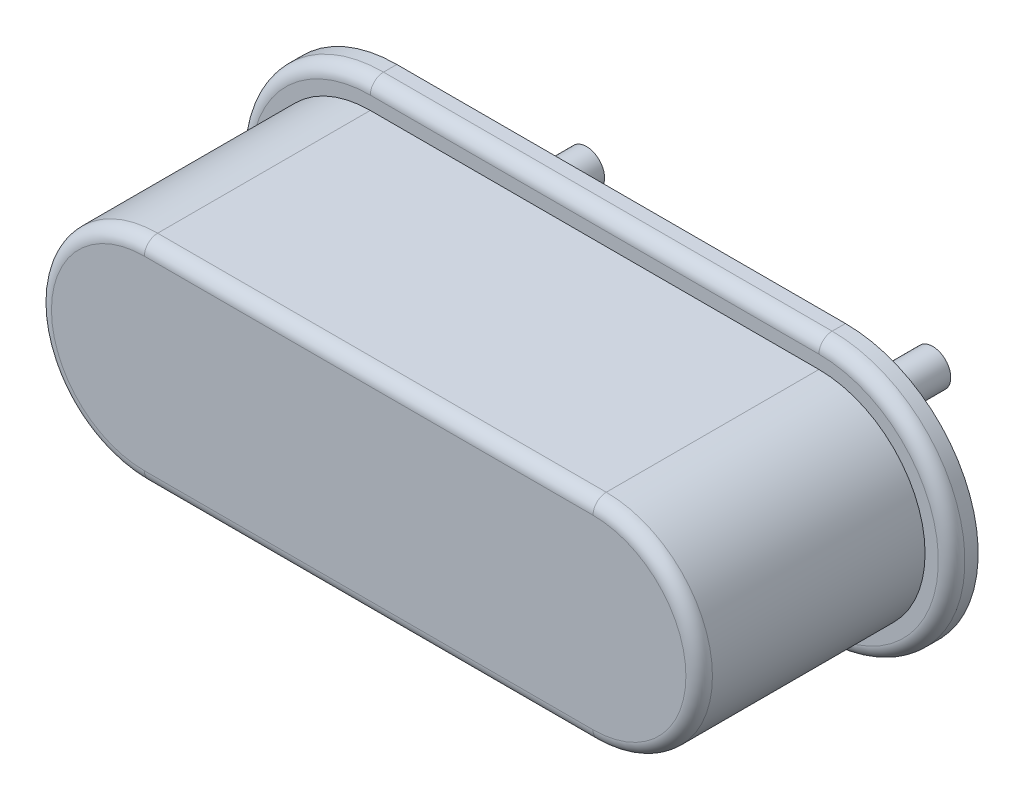
ISO-10303-21;
HEADER;
FILE_DESCRIPTION(('STEP AP214'),'2;1');
FILE_NAME('part.step','',(''),(''),'','','');
FILE_SCHEMA(('AUTOMOTIVE_DESIGN { 1 0 10303 214 1 1 1 1 }'));
ENDSEC;
DATA;
#1=APPLICATION_CONTEXT('core data for automotive mechanical design processes');
#2=APPLICATION_PROTOCOL_DEFINITION('international standard','automotive_design',2000,#1);
#3=PRODUCT_CONTEXT('',#1,'mechanical');
#4=PRODUCT('Part','Part','',(#3));
#5=PRODUCT_RELATED_PRODUCT_CATEGORY('part','',(#4));
#6=PRODUCT_DEFINITION_FORMATION('','',#4);
#7=PRODUCT_DEFINITION_CONTEXT('part definition',#1,'design');
#8=PRODUCT_DEFINITION('design','',#6,#7);
#9=PRODUCT_DEFINITION_SHAPE('','',#8);
#10=(LENGTH_UNIT() NAMED_UNIT(*) SI_UNIT(.MILLI.,.METRE.));
#11=(NAMED_UNIT(*) PLANE_ANGLE_UNIT() SI_UNIT($,.RADIAN.));
#12=(NAMED_UNIT(*) SI_UNIT($,.STERADIAN.) SOLID_ANGLE_UNIT());
#13=UNCERTAINTY_MEASURE_WITH_UNIT(LENGTH_MEASURE(1.E-05),#10,'distance_accuracy_value','');
#14=(GEOMETRIC_REPRESENTATION_CONTEXT(3) GLOBAL_UNCERTAINTY_ASSIGNED_CONTEXT((#13)) GLOBAL_UNIT_ASSIGNED_CONTEXT((#10,
#11,#12)) REPRESENTATION_CONTEXT('',''));
#15=CARTESIAN_POINT('',(0.,0.,0.));
#16=DIRECTION('',(0.,0.,1.));
#17=DIRECTION('',(1.,0.,0.));
#18=AXIS2_PLACEMENT_3D('',#15,#16,#17);
#19=CARTESIAN_POINT('',(3.11,1.84,0.));
#20=DIRECTION('',(0.,0.,1.));
#21=DIRECTION('',(1.,0.,0.));
#22=AXIS2_PLACEMENT_3D('',#19,#20,#21);
#23=PLANE('',#22);
#24=CARTESIAN_POINT('',(2.4,0.,0.));
#25=DIRECTION('',(0.,0.,1.));
#26=DIRECTION('',(1.,0.,0.));
#27=AXIS2_PLACEMENT_3D('',#24,#25,#26);
#28=CIRCLE('',#27,0.25);
#29=CARTESIAN_POINT('',(2.15,0.,0.));
#30=VERTEX_POINT('',#29);
#31=EDGE_CURVE('E240',#30,#30,#28,.T.);
#32=ORIENTED_EDGE('',*,*,#31,.T.);
#33=EDGE_LOOP('',(#32));
#34=FACE_BOUND('',#33,.T.);
#35=CARTESIAN_POINT('',(-2.4,0.,0.));
#36=DIRECTION('',(0.,0.,1.));
#37=DIRECTION('',(1.,0.,0.));
#38=AXIS2_PLACEMENT_3D('',#35,#36,#37);
#39=CIRCLE('',#38,0.25);
#40=CARTESIAN_POINT('',(-2.65,0.,0.));
#41=VERTEX_POINT('',#40);
#42=EDGE_CURVE('E230',#41,#41,#39,.T.);
#43=ORIENTED_EDGE('',*,*,#42,.T.);
#44=EDGE_LOOP('',(#43));
#45=FACE_BOUND('',#44,.T.);
#46=CARTESIAN_POINT('',(3.11,0.,0.));
#47=DIRECTION('',(0.,0.,1.));
#48=DIRECTION('',(1.,0.,0.));
#49=AXIS2_PLACEMENT_3D('',#46,#47,#48);
#50=CIRCLE('',#49,1.84);
#51=CARTESIAN_POINT('',(3.11,-1.84,0.));
#52=VERTEX_POINT('',#51);
#53=CARTESIAN_POINT('',(3.11,1.84,0.));
#54=VERTEX_POINT('',#53);
#55=EDGE_CURVE('E182',#52,#54,#50,.T.);
#56=ORIENTED_EDGE('',*,*,#55,.F.);
#57=DIRECTION('',(1.,0.,0.));
#58=VECTOR('',#57,1.);
#59=CARTESIAN_POINT('',(-3.11,-1.84,0.));
#60=LINE('',#59,#58);
#61=CARTESIAN_POINT('',(-3.11,-1.84,0.));
#62=VERTEX_POINT('',#61);
#63=EDGE_CURVE('E28',#62,#52,#60,.T.);
#64=ORIENTED_EDGE('',*,*,#63,.F.);
#65=CARTESIAN_POINT('',(-3.11,0.,0.));
#66=DIRECTION('',(0.,0.,1.));
#67=DIRECTION('',(1.,0.,0.));
#68=AXIS2_PLACEMENT_3D('',#65,#66,#67);
#69=CIRCLE('',#68,1.84);
#70=CARTESIAN_POINT('',(-3.11,1.84,0.));
#71=VERTEX_POINT('',#70);
#72=EDGE_CURVE('E11',#71,#62,#69,.T.);
#73=ORIENTED_EDGE('',*,*,#72,.F.);
#74=DIRECTION('',(-1.,0.,0.));
#75=VECTOR('',#74,1.);
#76=CARTESIAN_POINT('',(3.11,1.84,0.));
#77=LINE('',#76,#75);
#78=EDGE_CURVE('E154',#54,#71,#77,.T.);
#79=ORIENTED_EDGE('',*,*,#78,.F.);
#80=EDGE_LOOP('',(#56,#64,#73,#79));
#81=FACE_BOUND('',#80,.T.);
#82=ADVANCED_FACE('F17',(#34,#45,#81),#23,.F.);
#83=CARTESIAN_POINT('',(-3.11,0.,0.));
#84=DIRECTION('',(0.,0.,1.));
#85=DIRECTION('',(-1.,0.,0.));
#86=AXIS2_PLACEMENT_3D('',#83,#84,#85);
#87=CYLINDRICAL_SURFACE('',#86,1.84);
#88=CARTESIAN_POINT('',(-3.11,0.,0.184));
#89=DIRECTION('',(0.,0.,1.));
#90=DIRECTION('',(-1.,0.,0.));
#91=AXIS2_PLACEMENT_3D('',#88,#89,#90);
#92=CIRCLE('',#91,1.84);
#93=CARTESIAN_POINT('',(-3.11,1.84,0.184));
#94=VERTEX_POINT('',#93);
#95=CARTESIAN_POINT('',(-3.11,-1.84,0.184));
#96=VERTEX_POINT('',#95);
#97=EDGE_CURVE('E161',#94,#96,#92,.T.);
#98=ORIENTED_EDGE('',*,*,#97,.F.);
#99=DIRECTION('',(0.,0.,1.));
#100=VECTOR('',#99,1.);
#101=CARTESIAN_POINT('',(-3.11,1.84,0.));
#102=LINE('',#101,#100);
#103=EDGE_CURVE('E158',#71,#94,#102,.T.);
#104=ORIENTED_EDGE('',*,*,#103,.F.);
#105=ORIENTED_EDGE('',*,*,#72,.T.);
#106=DIRECTION('',(0.,0.,1.));
#107=VECTOR('',#106,1.);
#108=CARTESIAN_POINT('',(-3.11,-1.84,0.));
#109=LINE('',#108,#107);
#110=EDGE_CURVE('E185',#62,#96,#109,.T.);
#111=ORIENTED_EDGE('',*,*,#110,.T.);
#112=EDGE_LOOP('',(#98,#104,#105,#111));
#113=FACE_BOUND('',#112,.T.);
#114=ADVANCED_FACE('F159',(#113),#87,.T.);
#115=CARTESIAN_POINT('',(-3.11,-1.84,0.));
#116=DIRECTION('',(0.,-1.,0.));
#117=DIRECTION('',(0.,0.,-1.));
#118=AXIS2_PLACEMENT_3D('',#115,#116,#117);
#119=PLANE('',#118);
#120=DIRECTION('',(1.,0.,0.));
#121=VECTOR('',#120,1.);
#122=CARTESIAN_POINT('',(0.,-1.84,0.184));
#123=LINE('',#122,#121);
#124=CARTESIAN_POINT('',(3.11,-1.84,0.184));
#125=VERTEX_POINT('',#124);
#126=EDGE_CURVE('E176',#96,#125,#123,.T.);
#127=ORIENTED_EDGE('',*,*,#126,.F.);
#128=ORIENTED_EDGE('',*,*,#110,.F.);
#129=ORIENTED_EDGE('',*,*,#63,.T.);
#130=DIRECTION('',(0.,0.,1.));
#131=VECTOR('',#130,1.);
#132=CARTESIAN_POINT('',(3.11,-1.84,0.));
#133=LINE('',#132,#131);
#134=EDGE_CURVE('E166',#52,#125,#133,.T.);
#135=ORIENTED_EDGE('',*,*,#134,.T.);
#136=EDGE_LOOP('',(#127,#128,#129,#135));
#137=FACE_BOUND('',#136,.T.);
#138=ADVANCED_FACE('F374',(#137),#119,.T.);
#139=CARTESIAN_POINT('',(3.11,1.84,0.368));
#140=DIRECTION('',(0.,0.,1.));
#141=DIRECTION('',(1.,0.,0.));
#142=AXIS2_PLACEMENT_3D('',#139,#140,#141);
#143=PLANE('',#142);
#144=DIRECTION('',(1.,0.,0.));
#145=VECTOR('',#144,1.);
#146=CARTESIAN_POINT('',(3.11,1.472,0.368));
#147=LINE('',#146,#145);
#148=CARTESIAN_POINT('',(-3.11,1.472,0.368));
#149=VERTEX_POINT('',#148);
#150=CARTESIAN_POINT('',(3.11,1.472,0.368));
#151=VERTEX_POINT('',#150);
#152=EDGE_CURVE('E179',#149,#151,#147,.T.);
#153=ORIENTED_EDGE('',*,*,#152,.T.);
#154=CARTESIAN_POINT('',(3.11,0.,0.368));
#155=DIRECTION('',(0.,0.,-1.));
#156=DIRECTION('',(1.,0.,0.));
#157=AXIS2_PLACEMENT_3D('',#154,#155,#156);
#158=CIRCLE('',#157,1.472);
#159=CARTESIAN_POINT('',(3.11,-1.472,0.368));
#160=VERTEX_POINT('',#159);
#161=EDGE_CURVE('E210',#151,#160,#158,.T.);
#162=ORIENTED_EDGE('',*,*,#161,.T.);
#163=DIRECTION('',(-1.,0.,0.));
#164=VECTOR('',#163,1.);
#165=CARTESIAN_POINT('',(0.,-1.472,0.368));
#166=LINE('',#165,#164);
#167=CARTESIAN_POINT('',(-3.11,-1.472,0.368));
#168=VERTEX_POINT('',#167);
#169=EDGE_CURVE('E21',#160,#168,#166,.T.);
#170=ORIENTED_EDGE('',*,*,#169,.T.);
#171=CARTESIAN_POINT('',(-3.11,0.,0.368));
#172=DIRECTION('',(0.,0.,-1.));
#173=DIRECTION('',(1.,0.,0.));
#174=AXIS2_PLACEMENT_3D('',#171,#172,#173);
#175=CIRCLE('',#174,1.472);
#176=EDGE_CURVE('E115',#168,#149,#175,.T.);
#177=ORIENTED_EDGE('',*,*,#176,.T.);
#178=EDGE_LOOP('',(#153,#162,#170,#177));
#179=FACE_BOUND('',#178,.T.);
#180=CARTESIAN_POINT('',(3.11,0.,0.368));
#181=DIRECTION('',(0.,0.,-1.));
#182=DIRECTION('',(1.,0.,0.));
#183=AXIS2_PLACEMENT_3D('',#180,#181,#182);
#184=CIRCLE('',#183,1.656);
#185=CARTESIAN_POINT('',(3.11,1.656,0.368));
#186=VERTEX_POINT('',#185);
#187=CARTESIAN_POINT('',(3.11,-1.656,0.368));
#188=VERTEX_POINT('',#187);
#189=EDGE_CURVE('E249',#186,#188,#184,.T.);
#190=ORIENTED_EDGE('',*,*,#189,.F.);
#191=DIRECTION('',(1.,0.,0.));
#192=VECTOR('',#191,1.);
#193=CARTESIAN_POINT('',(3.11,1.656,0.368));
#194=LINE('',#193,#192);
#195=CARTESIAN_POINT('',(-3.11,1.656,0.368));
#196=VERTEX_POINT('',#195);
#197=EDGE_CURVE('E188',#196,#186,#194,.T.);
#198=ORIENTED_EDGE('',*,*,#197,.F.);
#199=CARTESIAN_POINT('',(-3.11,0.,0.368));
#200=DIRECTION('',(0.,0.,-1.));
#201=DIRECTION('',(-1.,0.,0.));
#202=AXIS2_PLACEMENT_3D('',#199,#200,#201);
#203=CIRCLE('',#202,1.656);
#204=CARTESIAN_POINT('',(-3.11,-1.656,0.368));
#205=VERTEX_POINT('',#204);
#206=EDGE_CURVE('E197',#205,#196,#203,.T.);
#207=ORIENTED_EDGE('',*,*,#206,.F.);
#208=DIRECTION('',(-1.,0.,0.));
#209=VECTOR('',#208,1.);
#210=CARTESIAN_POINT('',(0.,-1.656,0.368));
#211=LINE('',#210,#209);
#212=EDGE_CURVE('E222',#188,#205,#211,.T.);
#213=ORIENTED_EDGE('',*,*,#212,.F.);
#214=EDGE_LOOP('',(#190,#198,#207,#213));
#215=FACE_BOUND('',#214,.T.);
#216=ADVANCED_FACE('F397',(#179,#215),#143,.T.);
#217=CARTESIAN_POINT('',(3.11,0.,0.));
#218=DIRECTION('',(0.,0.,1.));
#219=DIRECTION('',(1.,0.,0.));
#220=AXIS2_PLACEMENT_3D('',#217,#218,#219);
#221=CYLINDRICAL_SURFACE('',#220,1.84);
#222=CARTESIAN_POINT('',(3.11,0.,0.184));
#223=DIRECTION('',(0.,0.,1.));
#224=DIRECTION('',(1.,0.,0.));
#225=AXIS2_PLACEMENT_3D('',#222,#223,#224);
#226=CIRCLE('',#225,1.84);
#227=CARTESIAN_POINT('',(3.11,1.84,0.184));
#228=VERTEX_POINT('',#227);
#229=EDGE_CURVE('E263',#125,#228,#226,.T.);
#230=ORIENTED_EDGE('',*,*,#229,.F.);
#231=ORIENTED_EDGE('',*,*,#134,.F.);
#232=ORIENTED_EDGE('',*,*,#55,.T.);
#233=DIRECTION('',(0.,0.,1.));
#234=VECTOR('',#233,1.);
#235=CARTESIAN_POINT('',(3.11,1.84,0.));
#236=LINE('',#235,#234);
#237=EDGE_CURVE('E169',#54,#228,#236,.T.);
#238=ORIENTED_EDGE('',*,*,#237,.T.);
#239=EDGE_LOOP('',(#230,#231,#232,#238));
#240=FACE_BOUND('',#239,.T.);
#241=ADVANCED_FACE('F310',(#240),#221,.T.);
#242=CARTESIAN_POINT('',(3.11,1.84,0.));
#243=DIRECTION('',(0.,1.,0.));
#244=DIRECTION('',(1.,0.,0.));
#245=AXIS2_PLACEMENT_3D('',#242,#243,#244);
#246=PLANE('',#245);
#247=DIRECTION('',(-1.,0.,0.));
#248=VECTOR('',#247,1.);
#249=CARTESIAN_POINT('',(3.11,1.84,0.184));
#250=LINE('',#249,#248);
#251=EDGE_CURVE('E191',#228,#94,#250,.T.);
#252=ORIENTED_EDGE('',*,*,#251,.F.);
#253=ORIENTED_EDGE('',*,*,#237,.F.);
#254=ORIENTED_EDGE('',*,*,#78,.T.);
#255=ORIENTED_EDGE('',*,*,#103,.T.);
#256=EDGE_LOOP('',(#252,#253,#254,#255));
#257=FACE_BOUND('',#256,.T.);
#258=ADVANCED_FACE('F168',(#257),#246,.T.);
#259=CARTESIAN_POINT('',(0.,-1.656,0.184));
#260=DIRECTION('',(1.,0.,0.));
#261=DIRECTION('',(0.,-0.707106781186547,0.707106781186548));
#262=AXIS2_PLACEMENT_3D('',#259,#260,#261);
#263=CYLINDRICAL_SURFACE('',#262,0.184);
#264=CARTESIAN_POINT('',(3.11,-1.656,0.184));
#265=DIRECTION('',(1.,0.,0.));
#266=DIRECTION('',(0.,0.,1.));
#267=AXIS2_PLACEMENT_3D('',#264,#265,#266);
#268=CIRCLE('',#267,0.184);
#269=EDGE_CURVE('E267',#188,#125,#268,.T.);
#270=ORIENTED_EDGE('',*,*,#269,.F.);
#271=ORIENTED_EDGE('',*,*,#212,.T.);
#272=CARTESIAN_POINT('',(-3.11,-1.656,0.184));
#273=DIRECTION('',(-1.,0.,0.));
#274=DIRECTION('',(0.,-1.,0.));
#275=AXIS2_PLACEMENT_3D('',#272,#273,#274);
#276=CIRCLE('',#275,0.184);
#277=EDGE_CURVE('E193',#96,#205,#276,.T.);
#278=ORIENTED_EDGE('',*,*,#277,.F.);
#279=ORIENTED_EDGE('',*,*,#126,.T.);
#280=EDGE_LOOP('',(#270,#271,#278,#279));
#281=FACE_BOUND('',#280,.T.);
#282=ADVANCED_FACE('F305',(#281),#263,.T.);
#283=CARTESIAN_POINT('',(-3.11,0.,0.184));
#284=DIRECTION('',(0.,0.,1.));
#285=DIRECTION('',(-1.,0.,0.));
#286=AXIS2_PLACEMENT_3D('',#283,#284,#285);
#287=TOROIDAL_SURFACE('',#286,1.656,0.184);
#288=ORIENTED_EDGE('',*,*,#277,.T.);
#289=ORIENTED_EDGE('',*,*,#206,.T.);
#290=CARTESIAN_POINT('',(-3.11,1.656,0.184));
#291=DIRECTION('',(1.,0.,0.));
#292=DIRECTION('',(0.,1.,0.));
#293=AXIS2_PLACEMENT_3D('',#290,#291,#292);
#294=CIRCLE('',#293,0.184);
#295=EDGE_CURVE('E192',#94,#196,#294,.T.);
#296=ORIENTED_EDGE('',*,*,#295,.F.);
#297=ORIENTED_EDGE('',*,*,#97,.T.);
#298=EDGE_LOOP('',(#288,#289,#296,#297));
#299=FACE_BOUND('',#298,.T.);
#300=ADVANCED_FACE('F395',(#299),#287,.T.);
#301=CARTESIAN_POINT('',(3.11,1.656,0.184));
#302=DIRECTION('',(-1.,0.,0.));
#303=DIRECTION('',(0.,0.707106781186548,0.707106781186547));
#304=AXIS2_PLACEMENT_3D('',#301,#302,#303);
#305=CYLINDRICAL_SURFACE('',#304,0.184);
#306=ORIENTED_EDGE('',*,*,#295,.T.);
#307=ORIENTED_EDGE('',*,*,#197,.T.);
#308=CARTESIAN_POINT('',(3.11,1.656,0.184));
#309=DIRECTION('',(1.,0.,0.));
#310=DIRECTION('',(0.,1.,0.));
#311=AXIS2_PLACEMENT_3D('',#308,#309,#310);
#312=CIRCLE('',#311,0.184);
#313=EDGE_CURVE('E253',#228,#186,#312,.T.);
#314=ORIENTED_EDGE('',*,*,#313,.F.);
#315=ORIENTED_EDGE('',*,*,#251,.T.);
#316=EDGE_LOOP('',(#306,#307,#314,#315));
#317=FACE_BOUND('',#316,.T.);
#318=ADVANCED_FACE('F525',(#317),#305,.T.);
#319=CARTESIAN_POINT('',(3.11,0.,0.184));
#320=DIRECTION('',(0.,0.,1.));
#321=DIRECTION('',(1.,0.,0.));
#322=AXIS2_PLACEMENT_3D('',#319,#320,#321);
#323=TOROIDAL_SURFACE('',#322,1.656,0.184);
#324=ORIENTED_EDGE('',*,*,#269,.T.);
#325=ORIENTED_EDGE('',*,*,#229,.T.);
#326=ORIENTED_EDGE('',*,*,#313,.T.);
#327=ORIENTED_EDGE('',*,*,#189,.T.);
#328=EDGE_LOOP('',(#324,#325,#326,#327));
#329=FACE_BOUND('',#328,.T.);
#330=ADVANCED_FACE('F313',(#329),#323,.T.);
#331=CARTESIAN_POINT('',(-3.11,0.,0.368));
#332=DIRECTION('',(0.,0.,1.));
#333=DIRECTION('',(-1.,0.,0.));
#334=AXIS2_PLACEMENT_3D('',#331,#332,#333);
#335=CYLINDRICAL_SURFACE('',#334,1.472);
#336=CARTESIAN_POINT('',(-3.11,0.,3.316));
#337=DIRECTION('',(0.,0.,1.));
#338=DIRECTION('',(-1.,0.,0.));
#339=AXIS2_PLACEMENT_3D('',#336,#337,#338);
#340=CIRCLE('',#339,1.472);
#341=CARTESIAN_POINT('',(-3.11,1.472,3.316));
#342=VERTEX_POINT('',#341);
#343=CARTESIAN_POINT('',(-3.11,-1.472,3.316));
#344=VERTEX_POINT('',#343);
#345=EDGE_CURVE('E232',#342,#344,#340,.T.);
#346=ORIENTED_EDGE('',*,*,#345,.F.);
#347=DIRECTION('',(0.,0.,1.));
#348=VECTOR('',#347,1.);
#349=CARTESIAN_POINT('',(-3.11,1.472,0.368));
#350=LINE('',#349,#348);
#351=EDGE_CURVE('E206',#149,#342,#350,.T.);
#352=ORIENTED_EDGE('',*,*,#351,.F.);
#353=ORIENTED_EDGE('',*,*,#176,.F.);
#354=DIRECTION('',(0.,0.,1.));
#355=VECTOR('',#354,1.);
#356=CARTESIAN_POINT('',(-3.11,-1.472,0.368));
#357=LINE('',#356,#355);
#358=EDGE_CURVE('E212',#168,#344,#357,.T.);
#359=ORIENTED_EDGE('',*,*,#358,.T.);
#360=EDGE_LOOP('',(#346,#352,#353,#359));
#361=FACE_BOUND('',#360,.T.);
#362=ADVANCED_FACE('F358',(#361),#335,.T.);
#363=CARTESIAN_POINT('',(-3.11,-1.472,0.368));
#364=DIRECTION('',(0.,-1.,0.));
#365=DIRECTION('',(0.,0.,-1.));
#366=AXIS2_PLACEMENT_3D('',#363,#364,#365);
#367=PLANE('',#366);
#368=DIRECTION('',(1.,0.,0.));
#369=VECTOR('',#368,1.);
#370=CARTESIAN_POINT('',(0.,-1.472,3.316));
#371=LINE('',#370,#369);
#372=CARTESIAN_POINT('',(3.11,-1.472,3.316));
#373=VERTEX_POINT('',#372);
#374=EDGE_CURVE('E214',#344,#373,#371,.T.);
#375=ORIENTED_EDGE('',*,*,#374,.F.);
#376=ORIENTED_EDGE('',*,*,#358,.F.);
#377=ORIENTED_EDGE('',*,*,#169,.F.);
#378=DIRECTION('',(0.,0.,1.));
#379=VECTOR('',#378,1.);
#380=CARTESIAN_POINT('',(3.11,-1.472,0.368));
#381=LINE('',#380,#379);
#382=EDGE_CURVE('E209',#160,#373,#381,.T.);
#383=ORIENTED_EDGE('',*,*,#382,.T.);
#384=EDGE_LOOP('',(#375,#376,#377,#383));
#385=FACE_BOUND('',#384,.T.);
#386=ADVANCED_FACE('F387',(#385),#367,.T.);
#387=CARTESIAN_POINT('',(3.11,1.472,3.5));
#388=DIRECTION('',(0.,0.,1.));
#389=DIRECTION('',(1.,0.,0.));
#390=AXIS2_PLACEMENT_3D('',#387,#388,#389);
#391=PLANE('',#390);
#392=CARTESIAN_POINT('',(3.11,0.,3.5));
#393=DIRECTION('',(0.,0.,-1.));
#394=DIRECTION('',(1.,0.,0.));
#395=AXIS2_PLACEMENT_3D('',#392,#393,#394);
#396=CIRCLE('',#395,1.288);
#397=CARTESIAN_POINT('',(3.11,1.288,3.5));
#398=VERTEX_POINT('',#397);
#399=CARTESIAN_POINT('',(3.11,-1.288,3.5));
#400=VERTEX_POINT('',#399);
#401=EDGE_CURVE('E281',#398,#400,#396,.T.);
#402=ORIENTED_EDGE('',*,*,#401,.F.);
#403=DIRECTION('',(1.,0.,0.));
#404=VECTOR('',#403,1.);
#405=CARTESIAN_POINT('',(3.11,1.288,3.5));
#406=LINE('',#405,#404);
#407=CARTESIAN_POINT('',(-3.11,1.288,3.5));
#408=VERTEX_POINT('',#407);
#409=EDGE_CURVE('E262',#408,#398,#406,.T.);
#410=ORIENTED_EDGE('',*,*,#409,.F.);
#411=CARTESIAN_POINT('',(-3.11,0.,3.5));
#412=DIRECTION('',(0.,0.,-1.));
#413=DIRECTION('',(-1.,0.,0.));
#414=AXIS2_PLACEMENT_3D('',#411,#412,#413);
#415=CIRCLE('',#414,1.288);
#416=CARTESIAN_POINT('',(-3.11,-1.288,3.5));
#417=VERTEX_POINT('',#416);
#418=EDGE_CURVE('E204',#417,#408,#415,.T.);
#419=ORIENTED_EDGE('',*,*,#418,.F.);
#420=DIRECTION('',(-1.,0.,0.));
#421=VECTOR('',#420,1.);
#422=CARTESIAN_POINT('',(0.,-1.288,3.5));
#423=LINE('',#422,#421);
#424=EDGE_CURVE('E219',#400,#417,#423,.T.);
#425=ORIENTED_EDGE('',*,*,#424,.F.);
#426=EDGE_LOOP('',(#402,#410,#419,#425));
#427=FACE_BOUND('',#426,.T.);
#428=ADVANCED_FACE('F345',(#427),#391,.T.);
#429=CARTESIAN_POINT('',(3.11,0.,0.368));
#430=DIRECTION('',(0.,0.,1.));
#431=DIRECTION('',(1.,0.,0.));
#432=AXIS2_PLACEMENT_3D('',#429,#430,#431);
#433=CYLINDRICAL_SURFACE('',#432,1.472);
#434=CARTESIAN_POINT('',(3.11,0.,3.316));
#435=DIRECTION('',(0.,0.,1.));
#436=DIRECTION('',(1.,0.,0.));
#437=AXIS2_PLACEMENT_3D('',#434,#435,#436);
#438=CIRCLE('',#437,1.472);
#439=CARTESIAN_POINT('',(3.11,1.472,3.316));
#440=VERTEX_POINT('',#439);
#441=EDGE_CURVE('E272',#373,#440,#438,.T.);
#442=ORIENTED_EDGE('',*,*,#441,.F.);
#443=ORIENTED_EDGE('',*,*,#382,.F.);
#444=ORIENTED_EDGE('',*,*,#161,.F.);
#445=DIRECTION('',(0.,0.,1.));
#446=VECTOR('',#445,1.);
#447=CARTESIAN_POINT('',(3.11,1.472,0.368));
#448=LINE('',#447,#446);
#449=EDGE_CURVE('E218',#151,#440,#448,.T.);
#450=ORIENTED_EDGE('',*,*,#449,.T.);
#451=EDGE_LOOP('',(#442,#443,#444,#450));
#452=FACE_BOUND('',#451,.T.);
#453=ADVANCED_FACE('F352',(#452),#433,.T.);
#454=CARTESIAN_POINT('',(3.11,1.472,0.368));
#455=DIRECTION('',(0.,1.,0.));
#456=DIRECTION('',(1.,0.,0.));
#457=AXIS2_PLACEMENT_3D('',#454,#455,#456);
#458=PLANE('',#457);
#459=DIRECTION('',(-1.,0.,0.));
#460=VECTOR('',#459,1.);
#461=CARTESIAN_POINT('',(3.11,1.472,3.316));
#462=LINE('',#461,#460);
#463=EDGE_CURVE('E205',#440,#342,#462,.T.);
#464=ORIENTED_EDGE('',*,*,#463,.F.);
#465=ORIENTED_EDGE('',*,*,#449,.F.);
#466=ORIENTED_EDGE('',*,*,#152,.F.);
#467=ORIENTED_EDGE('',*,*,#351,.T.);
#468=EDGE_LOOP('',(#464,#465,#466,#467));
#469=FACE_BOUND('',#468,.T.);
#470=ADVANCED_FACE('F356',(#469),#458,.T.);
#471=CARTESIAN_POINT('',(0.,-1.288,3.316));
#472=DIRECTION('',(1.,0.,0.));
#473=DIRECTION('',(0.,-0.707106781186547,0.707106781186548));
#474=AXIS2_PLACEMENT_3D('',#471,#472,#473);
#475=CYLINDRICAL_SURFACE('',#474,0.184);
#476=CARTESIAN_POINT('',(3.11,-1.288,3.316));
#477=DIRECTION('',(1.,0.,0.));
#478=DIRECTION('',(0.,0.,1.));
#479=AXIS2_PLACEMENT_3D('',#476,#477,#478);
#480=CIRCLE('',#479,0.184);
#481=EDGE_CURVE('E268',#400,#373,#480,.T.);
#482=ORIENTED_EDGE('',*,*,#481,.F.);
#483=ORIENTED_EDGE('',*,*,#424,.T.);
#484=CARTESIAN_POINT('',(-3.11,-1.288,3.316));
#485=DIRECTION('',(-1.,0.,0.));
#486=DIRECTION('',(0.,-1.,0.));
#487=AXIS2_PLACEMENT_3D('',#484,#485,#486);
#488=CIRCLE('',#487,0.184);
#489=EDGE_CURVE('E200',#344,#417,#488,.T.);
#490=ORIENTED_EDGE('',*,*,#489,.F.);
#491=ORIENTED_EDGE('',*,*,#374,.T.);
#492=EDGE_LOOP('',(#482,#483,#490,#491));
#493=FACE_BOUND('',#492,.T.);
#494=ADVANCED_FACE('F348',(#493),#475,.T.);
#495=CARTESIAN_POINT('',(-3.11,0.,3.316));
#496=DIRECTION('',(0.,0.,1.));
#497=DIRECTION('',(-1.,0.,0.));
#498=AXIS2_PLACEMENT_3D('',#495,#496,#497);
#499=TOROIDAL_SURFACE('',#498,1.288,0.184);
#500=ORIENTED_EDGE('',*,*,#489,.T.);
#501=ORIENTED_EDGE('',*,*,#418,.T.);
#502=CARTESIAN_POINT('',(-3.11,1.288,3.316));
#503=DIRECTION('',(1.,0.,0.));
#504=DIRECTION('',(0.,1.,0.));
#505=AXIS2_PLACEMENT_3D('',#502,#503,#504);
#506=CIRCLE('',#505,0.184);
#507=EDGE_CURVE('E277',#342,#408,#506,.T.);
#508=ORIENTED_EDGE('',*,*,#507,.F.);
#509=ORIENTED_EDGE('',*,*,#345,.T.);
#510=EDGE_LOOP('',(#500,#501,#508,#509));
#511=FACE_BOUND('',#510,.T.);
#512=ADVANCED_FACE('F19',(#511),#499,.T.);
#513=CARTESIAN_POINT('',(3.11,1.288,3.316));
#514=DIRECTION('',(-1.,0.,0.));
#515=DIRECTION('',(0.,0.707106781186548,0.707106781186548));
#516=AXIS2_PLACEMENT_3D('',#513,#514,#515);
#517=CYLINDRICAL_SURFACE('',#516,0.184);
#518=ORIENTED_EDGE('',*,*,#507,.T.);
#519=ORIENTED_EDGE('',*,*,#409,.T.);
#520=CARTESIAN_POINT('',(3.11,1.288,3.316));
#521=DIRECTION('',(1.,0.,0.));
#522=DIRECTION('',(0.,1.,0.));
#523=AXIS2_PLACEMENT_3D('',#520,#521,#522);
#524=CIRCLE('',#523,0.184);
#525=EDGE_CURVE('E276',#440,#398,#524,.T.);
#526=ORIENTED_EDGE('',*,*,#525,.F.);
#527=ORIENTED_EDGE('',*,*,#463,.T.);
#528=EDGE_LOOP('',(#518,#519,#526,#527));
#529=FACE_BOUND('',#528,.T.);
#530=ADVANCED_FACE('F339',(#529),#517,.T.);
#531=CARTESIAN_POINT('',(3.11,0.,3.316));
#532=DIRECTION('',(0.,0.,1.));
#533=DIRECTION('',(1.,0.,0.));
#534=AXIS2_PLACEMENT_3D('',#531,#532,#533);
#535=TOROIDAL_SURFACE('',#534,1.288,0.184);
#536=ORIENTED_EDGE('',*,*,#481,.T.);
#537=ORIENTED_EDGE('',*,*,#441,.T.);
#538=ORIENTED_EDGE('',*,*,#525,.T.);
#539=ORIENTED_EDGE('',*,*,#401,.T.);
#540=EDGE_LOOP('',(#536,#537,#538,#539));
#541=FACE_BOUND('',#540,.T.);
#542=ADVANCED_FACE('F332',(#541),#535,.T.);
#543=CARTESIAN_POINT('',(2.4,0.,-1.92));
#544=DIRECTION('',(0.,0.,-1.));
#545=DIRECTION('',(0.,-1.,0.));
#546=AXIS2_PLACEMENT_3D('',#543,#544,#545);
#547=PLANE('',#546);
#548=CARTESIAN_POINT('',(2.4,0.,-1.92));
#549=DIRECTION('',(0.,0.,-1.));
#550=DIRECTION('',(1.,0.,0.));
#551=AXIS2_PLACEMENT_3D('',#548,#549,#550);
#552=CIRCLE('',#551,0.25);
#553=CARTESIAN_POINT('',(2.15,0.,-1.92));
#554=VERTEX_POINT('',#553);
#555=EDGE_CURVE('E241',#554,#554,#552,.T.);
#556=ORIENTED_EDGE('',*,*,#555,.T.);
#557=EDGE_LOOP('',(#556));
#558=FACE_BOUND('',#557,.T.);
#559=ADVANCED_FACE('F379',(#558),#547,.T.);
#560=CARTESIAN_POINT('',(2.4,0.,-0.96));
#561=DIRECTION('',(0.,0.,-1.));
#562=DIRECTION('',(1.,0.,0.));
#563=AXIS2_PLACEMENT_3D('',#560,#561,#562);
#564=CYLINDRICAL_SURFACE('',#563,0.25);
#565=ORIENTED_EDGE('',*,*,#555,.F.);
#566=DIRECTION('',(0.,0.,1.));
#567=VECTOR('',#566,1.);
#568=CARTESIAN_POINT('',(2.15,0.,-0.96));
#569=LINE('',#568,#567);
#570=EDGE_CURVE('E236',#554,#30,#569,.T.);
#571=ORIENTED_EDGE('',*,*,#570,.T.);
#572=ORIENTED_EDGE('',*,*,#31,.F.);
#573=ORIENTED_EDGE('',*,*,#570,.F.);
#574=EDGE_LOOP('',(#565,#571,#572,#573));
#575=FACE_BOUND('',#574,.T.);
#576=ADVANCED_FACE('F388',(#575),#564,.T.);
#577=CARTESIAN_POINT('',(-2.4,0.,-1.92));
#578=DIRECTION('',(0.,0.,-1.));
#579=DIRECTION('',(0.,-1.,0.));
#580=AXIS2_PLACEMENT_3D('',#577,#578,#579);
#581=PLANE('',#580);
#582=CARTESIAN_POINT('',(-2.4,0.,-1.92));
#583=DIRECTION('',(0.,0.,-1.));
#584=DIRECTION('',(1.,0.,0.));
#585=AXIS2_PLACEMENT_3D('',#582,#583,#584);
#586=CIRCLE('',#585,0.25);
#587=CARTESIAN_POINT('',(-2.65,0.,-1.92));
#588=VERTEX_POINT('',#587);
#589=EDGE_CURVE('E231',#588,#588,#586,.T.);
#590=ORIENTED_EDGE('',*,*,#589,.T.);
#591=EDGE_LOOP('',(#590));
#592=FACE_BOUND('',#591,.T.);
#593=ADVANCED_FACE('F391',(#592),#581,.T.);
#594=CARTESIAN_POINT('',(-2.4,0.,-0.96));
#595=DIRECTION('',(0.,0.,-1.));
#596=DIRECTION('',(1.,0.,0.));
#597=AXIS2_PLACEMENT_3D('',#594,#595,#596);
#598=CYLINDRICAL_SURFACE('',#597,0.25);
#599=ORIENTED_EDGE('',*,*,#589,.F.);
#600=DIRECTION('',(0.,0.,1.));
#601=VECTOR('',#600,1.);
#602=CARTESIAN_POINT('',(-2.65,0.,-0.96));
#603=LINE('',#602,#601);
#604=EDGE_CURVE('E226',#588,#41,#603,.T.);
#605=ORIENTED_EDGE('',*,*,#604,.T.);
#606=ORIENTED_EDGE('',*,*,#42,.F.);
#607=ORIENTED_EDGE('',*,*,#604,.F.);
#608=EDGE_LOOP('',(#599,#605,#606,#607));
#609=FACE_BOUND('',#608,.T.);
#610=ADVANCED_FACE('F401',(#609),#598,.T.);
#611=CLOSED_SHELL('',(#82,#114,#138,#216,#241,#258,#282,#300,#318,#330,#362,#386,#428,#453,#470,
#494,#512,#530,#542,#559,#576,#593,#610));
#612=MANIFOLD_SOLID_BREP('B1',#611);
#613=ADVANCED_BREP_SHAPE_REPRESENTATION('',(#18,#612),#14);
#614=SHAPE_DEFINITION_REPRESENTATION(#9,#613);
ENDSEC;
END-ISO-10303-21;
